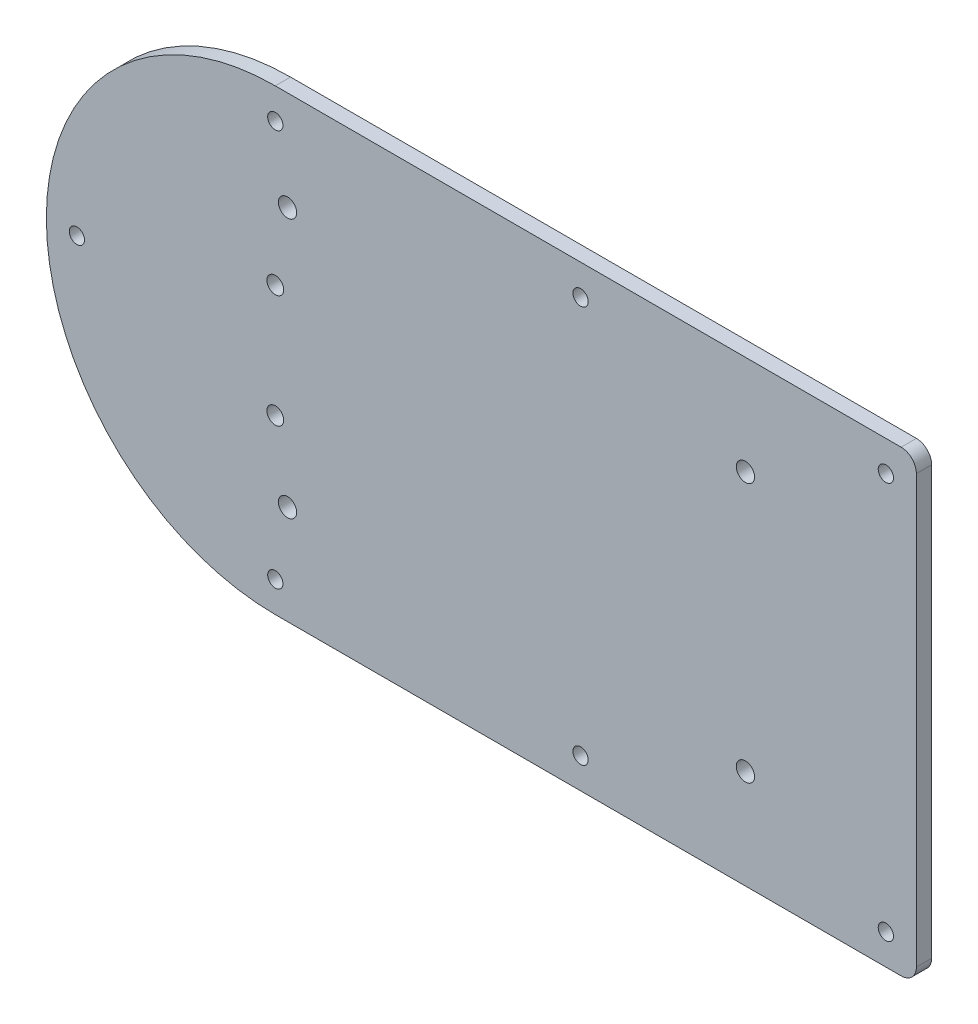
ISO-10303-21;
HEADER;
FILE_DESCRIPTION(('STEP AP214'),'2;1');
FILE_NAME('part.step','',(''),(''),'','','');
FILE_SCHEMA(('AUTOMOTIVE_DESIGN { 1 0 10303 214 1 1 1 1 }'));
ENDSEC;
DATA;
#1=APPLICATION_CONTEXT('core data for automotive mechanical design processes');
#2=APPLICATION_PROTOCOL_DEFINITION('international standard','automotive_design',2000,#1);
#3=PRODUCT_CONTEXT('',#1,'mechanical');
#4=PRODUCT('Part','Part','',(#3));
#5=PRODUCT_RELATED_PRODUCT_CATEGORY('part','',(#4));
#6=PRODUCT_DEFINITION_FORMATION('','',#4);
#7=PRODUCT_DEFINITION_CONTEXT('part definition',#1,'design');
#8=PRODUCT_DEFINITION('design','',#6,#7);
#9=PRODUCT_DEFINITION_SHAPE('','',#8);
#10=(LENGTH_UNIT() NAMED_UNIT(*) SI_UNIT(.MILLI.,.METRE.));
#11=(NAMED_UNIT(*) PLANE_ANGLE_UNIT() SI_UNIT($,.RADIAN.));
#12=(NAMED_UNIT(*) SI_UNIT($,.STERADIAN.) SOLID_ANGLE_UNIT());
#13=UNCERTAINTY_MEASURE_WITH_UNIT(LENGTH_MEASURE(1.E-05),#10,'distance_accuracy_value','');
#14=(GEOMETRIC_REPRESENTATION_CONTEXT(3) GLOBAL_UNCERTAINTY_ASSIGNED_CONTEXT((#13)) GLOBAL_UNIT_ASSIGNED_CONTEXT((#10,
#11,#12)) REPRESENTATION_CONTEXT('',''));
#15=CARTESIAN_POINT('',(0.,0.,0.));
#16=DIRECTION('',(0.,0.,1.));
#17=DIRECTION('',(1.,0.,0.));
#18=AXIS2_PLACEMENT_3D('',#15,#16,#17);
#19=CARTESIAN_POINT('',(30.0006920415225,17.5455264458724,5.));
#20=DIRECTION('',(0.,0.,1.));
#21=DIRECTION('',(1.,0.,0.));
#22=AXIS2_PLACEMENT_3D('',#19,#20,#21);
#23=PLANE('',#22);
#24=CARTESIAN_POINT('',(130.000692041523,82.5455264458725,5.));
#25=DIRECTION('',(0.,0.,1.));
#26=DIRECTION('',(1.,0.,0.));
#27=AXIS2_PLACEMENT_3D('',#24,#25,#26);
#28=CIRCLE('',#27,2.5);
#29=CARTESIAN_POINT('',(132.500692041523,82.5455264458725,5.));
#30=VERTEX_POINT('',#29);
#31=EDGE_CURVE('E225',#30,#30,#28,.T.);
#32=ORIENTED_EDGE('',*,*,#31,.F.);
#33=EDGE_LOOP('',(#32));
#34=FACE_BOUND('',#33,.T.);
#35=CARTESIAN_POINT('',(230.000692041523,-47.4544735541276,5.));
#36=DIRECTION('',(0.,0.,1.));
#37=DIRECTION('',(1.,0.,0.));
#38=AXIS2_PLACEMENT_3D('',#35,#36,#37);
#39=CIRCLE('',#38,2.5);
#40=CARTESIAN_POINT('',(232.500692041523,-47.4544735541276,5.));
#41=VERTEX_POINT('',#40);
#42=EDGE_CURVE('E237',#41,#41,#39,.T.);
#43=ORIENTED_EDGE('',*,*,#42,.F.);
#44=EDGE_LOOP('',(#43));
#45=FACE_BOUND('',#44,.T.);
#46=CARTESIAN_POINT('',(30.0006920415225,-47.4544735541276,5.));
#47=DIRECTION('',(0.,0.,1.));
#48=DIRECTION('',(1.,0.,0.));
#49=AXIS2_PLACEMENT_3D('',#46,#47,#48);
#50=CIRCLE('',#49,2.5);
#51=CARTESIAN_POINT('',(32.5006920415225,-47.4544735541276,5.));
#52=VERTEX_POINT('',#51);
#53=EDGE_CURVE('E249',#52,#52,#50,.T.);
#54=ORIENTED_EDGE('',*,*,#53,.F.);
#55=EDGE_LOOP('',(#54));
#56=FACE_BOUND('',#55,.T.);
#57=CARTESIAN_POINT('',(30.0006920415225,-0.95447355412754,5.));
#58=DIRECTION('',(0.,0.,1.));
#59=DIRECTION('',(1.,0.,0.));
#60=AXIS2_PLACEMENT_3D('',#57,#58,#59);
#61=CIRCLE('',#60,2.75);
#62=CARTESIAN_POINT('',(32.7506920415225,-0.95447355412754,5.));
#63=VERTEX_POINT('',#62);
#64=EDGE_CURVE('E261',#63,#63,#61,.T.);
#65=ORIENTED_EDGE('',*,*,#64,.F.);
#66=EDGE_LOOP('',(#65));
#67=FACE_BOUND('',#66,.T.);
#68=CARTESIAN_POINT('',(34.0006920415225,60.0455264458724,5.));
#69=DIRECTION('',(0.,0.,1.));
#70=DIRECTION('',(1.,0.,0.));
#71=AXIS2_PLACEMENT_3D('',#68,#69,#70);
#72=CIRCLE('',#71,3.);
#73=CARTESIAN_POINT('',(37.0006920415225,60.0455264458724,5.));
#74=VERTEX_POINT('',#73);
#75=EDGE_CURVE('E273',#74,#74,#72,.T.);
#76=ORIENTED_EDGE('',*,*,#75,.F.);
#77=EDGE_LOOP('',(#76));
#78=FACE_BOUND('',#77,.T.);
#79=CARTESIAN_POINT('',(-34.9993079584775,17.5455264458724,5.));
#80=DIRECTION('',(0.,0.,1.));
#81=DIRECTION('',(1.,0.,0.));
#82=AXIS2_PLACEMENT_3D('',#79,#80,#81);
#83=CIRCLE('',#82,2.5);
#84=CARTESIAN_POINT('',(-32.4993079584775,17.5455264458724,5.));
#85=VERTEX_POINT('',#84);
#86=EDGE_CURVE('E285',#85,#85,#83,.T.);
#87=ORIENTED_EDGE('',*,*,#86,.F.);
#88=EDGE_LOOP('',(#87));
#89=FACE_BOUND('',#88,.T.);
#90=CARTESIAN_POINT('',(30.0006920415225,17.5455264458724,5.));
#91=DIRECTION('',(0.,0.,1.));
#92=DIRECTION('',(1.,0.,0.));
#93=AXIS2_PLACEMENT_3D('',#90,#91,#92);
#94=CIRCLE('',#93,75.);
#95=CARTESIAN_POINT('',(30.0006920415225,92.5455264458725,5.));
#96=VERTEX_POINT('',#95);
#97=CARTESIAN_POINT('',(30.0006920415225,-57.4544735541275,5.));
#98=VERTEX_POINT('',#97);
#99=EDGE_CURVE('E129',#96,#98,#94,.T.);
#100=ORIENTED_EDGE('',*,*,#99,.T.);
#101=DIRECTION('',(1.,0.,0.));
#102=VECTOR('',#101,1.);
#103=CARTESIAN_POINT('',(30.0006920415225,-57.4544735541275,5.));
#104=LINE('',#103,#102);
#105=CARTESIAN_POINT('',(235.000692041522,-57.4544735541275,5.));
#106=VERTEX_POINT('',#105);
#107=EDGE_CURVE('E87',#98,#106,#104,.T.);
#108=ORIENTED_EDGE('',*,*,#107,.T.);
#109=CARTESIAN_POINT('',(235.000692041523,-52.4544735541275,5.));
#110=DIRECTION('',(0.,0.,1.));
#111=DIRECTION('',(1.,0.,0.));
#112=AXIS2_PLACEMENT_3D('',#109,#110,#111);
#113=CIRCLE('',#112,5.);
#114=CARTESIAN_POINT('',(240.000692041523,-52.4544735541275,5.));
#115=VERTEX_POINT('',#114);
#116=EDGE_CURVE('E100',#106,#115,#113,.T.);
#117=ORIENTED_EDGE('',*,*,#116,.T.);
#118=DIRECTION('',(0.,1.,0.));
#119=VECTOR('',#118,1.);
#120=CARTESIAN_POINT('',(240.000692041523,87.5455264458724,5.));
#121=LINE('',#120,#119);
#122=CARTESIAN_POINT('',(240.000692041523,87.5455264458724,5.));
#123=VERTEX_POINT('',#122);
#124=EDGE_CURVE('E94',#115,#123,#121,.T.);
#125=ORIENTED_EDGE('',*,*,#124,.T.);
#126=CARTESIAN_POINT('',(235.000692041523,87.5455264458725,5.));
#127=DIRECTION('',(0.,0.,1.));
#128=DIRECTION('',(-1.,0.,0.));
#129=AXIS2_PLACEMENT_3D('',#126,#127,#128);
#130=CIRCLE('',#129,5.);
#131=CARTESIAN_POINT('',(235.000692041522,92.5455264458725,5.));
#132=VERTEX_POINT('',#131);
#133=EDGE_CURVE('E98',#123,#132,#130,.T.);
#134=ORIENTED_EDGE('',*,*,#133,.T.);
#135=DIRECTION('',(-1.,0.,0.));
#136=VECTOR('',#135,1.);
#137=CARTESIAN_POINT('',(30.0006920415225,92.5455264458725,5.));
#138=LINE('',#137,#136);
#139=EDGE_CURVE('E50',#132,#96,#138,.T.);
#140=ORIENTED_EDGE('',*,*,#139,.T.);
#141=EDGE_LOOP('',(#100,#108,#117,#125,#134,#140));
#142=FACE_BOUND('',#141,.T.);
#143=CARTESIAN_POINT('',(184.000692041523,60.0455264458725,5.));
#144=DIRECTION('',(0.,0.,1.));
#145=DIRECTION('',(1.,0.,0.));
#146=AXIS2_PLACEMENT_3D('',#143,#144,#145);
#147=CIRCLE('',#146,2.99999999999999);
#148=CARTESIAN_POINT('',(187.000692041523,60.0455264458725,5.));
#149=VERTEX_POINT('',#148);
#150=EDGE_CURVE('E122',#149,#149,#147,.T.);
#151=ORIENTED_EDGE('',*,*,#150,.F.);
#152=EDGE_LOOP('',(#151));
#153=FACE_BOUND('',#152,.T.);
#154=CARTESIAN_POINT('',(184.000692041523,-24.9544735541275,5.));
#155=DIRECTION('',(0.,0.,1.));
#156=DIRECTION('',(1.,0.,0.));
#157=AXIS2_PLACEMENT_3D('',#154,#155,#156);
#158=CIRCLE('',#157,2.99999999999999);
#159=CARTESIAN_POINT('',(187.000692041523,-24.9544735541275,5.));
#160=VERTEX_POINT('',#159);
#161=EDGE_CURVE('E279',#160,#160,#158,.T.);
#162=ORIENTED_EDGE('',*,*,#161,.F.);
#163=EDGE_LOOP('',(#162));
#164=FACE_BOUND('',#163,.T.);
#165=CARTESIAN_POINT('',(34.0006920415225,-24.9544735541276,5.));
#166=DIRECTION('',(0.,0.,1.));
#167=DIRECTION('',(1.,0.,0.));
#168=AXIS2_PLACEMENT_3D('',#165,#166,#167);
#169=CIRCLE('',#168,3.);
#170=CARTESIAN_POINT('',(37.0006920415225,-24.9544735541276,5.));
#171=VERTEX_POINT('',#170);
#172=EDGE_CURVE('E267',#171,#171,#169,.T.);
#173=ORIENTED_EDGE('',*,*,#172,.F.);
#174=EDGE_LOOP('',(#173));
#175=FACE_BOUND('',#174,.T.);
#176=CARTESIAN_POINT('',(30.0006920415225,36.0455264458724,5.));
#177=DIRECTION('',(0.,0.,1.));
#178=DIRECTION('',(1.,0.,0.));
#179=AXIS2_PLACEMENT_3D('',#176,#177,#178);
#180=CIRCLE('',#179,2.75);
#181=CARTESIAN_POINT('',(32.7506920415225,36.0455264458724,5.));
#182=VERTEX_POINT('',#181);
#183=EDGE_CURVE('E255',#182,#182,#180,.T.);
#184=ORIENTED_EDGE('',*,*,#183,.F.);
#185=EDGE_LOOP('',(#184));
#186=FACE_BOUND('',#185,.T.);
#187=CARTESIAN_POINT('',(30.0006920415225,82.5455264458725,5.));
#188=DIRECTION('',(0.,0.,1.));
#189=DIRECTION('',(1.,0.,0.));
#190=AXIS2_PLACEMENT_3D('',#187,#188,#189);
#191=CIRCLE('',#190,2.5);
#192=CARTESIAN_POINT('',(32.5006920415225,82.5455264458725,5.));
#193=VERTEX_POINT('',#192);
#194=EDGE_CURVE('E243',#193,#193,#191,.T.);
#195=ORIENTED_EDGE('',*,*,#194,.F.);
#196=EDGE_LOOP('',(#195));
#197=FACE_BOUND('',#196,.T.);
#198=CARTESIAN_POINT('',(230.000692041523,82.5455264458725,5.));
#199=DIRECTION('',(0.,0.,1.));
#200=DIRECTION('',(1.,0.,0.));
#201=AXIS2_PLACEMENT_3D('',#198,#199,#200);
#202=CIRCLE('',#201,2.5);
#203=CARTESIAN_POINT('',(232.500692041523,82.5455264458725,5.));
#204=VERTEX_POINT('',#203);
#205=EDGE_CURVE('E231',#204,#204,#202,.T.);
#206=ORIENTED_EDGE('',*,*,#205,.F.);
#207=EDGE_LOOP('',(#206));
#208=FACE_BOUND('',#207,.T.);
#209=CARTESIAN_POINT('',(130.000692041523,-47.4544735541276,5.));
#210=DIRECTION('',(0.,0.,1.));
#211=DIRECTION('',(1.,0.,0.));
#212=AXIS2_PLACEMENT_3D('',#209,#210,#211);
#213=CIRCLE('',#212,2.5);
#214=CARTESIAN_POINT('',(132.500692041523,-47.4544735541276,5.));
#215=VERTEX_POINT('',#214);
#216=EDGE_CURVE('E216',#215,#215,#213,.T.);
#217=ORIENTED_EDGE('',*,*,#216,.F.);
#218=EDGE_LOOP('',(#217));
#219=FACE_BOUND('',#218,.T.);
#220=ADVANCED_FACE('F33',(#34,#45,#56,#67,#78,#89,#142,#153,#164,#175,#186,#197,#208,#219),#23,.T.);
#221=CARTESIAN_POINT('',(30.0006920415225,17.5455264458724,0.));
#222=DIRECTION('',(0.,0.,1.));
#223=DIRECTION('',(1.,0.,0.));
#224=AXIS2_PLACEMENT_3D('',#221,#222,#223);
#225=PLANE('',#224);
#226=CARTESIAN_POINT('',(30.0006920415225,17.5455264458724,0.));
#227=DIRECTION('',(0.,0.,1.));
#228=DIRECTION('',(1.,0.,0.));
#229=AXIS2_PLACEMENT_3D('',#226,#227,#228);
#230=CIRCLE('',#229,75.);
#231=CARTESIAN_POINT('',(30.0006920415225,92.5455264458725,0.));
#232=VERTEX_POINT('',#231);
#233=CARTESIAN_POINT('',(30.0006920415225,-57.4544735541275,0.));
#234=VERTEX_POINT('',#233);
#235=EDGE_CURVE('E118',#232,#234,#230,.T.);
#236=ORIENTED_EDGE('',*,*,#235,.F.);
#237=DIRECTION('',(-1.,0.,0.));
#238=VECTOR('',#237,1.);
#239=CARTESIAN_POINT('',(30.0006920415225,92.5455264458725,0.));
#240=LINE('',#239,#238);
#241=CARTESIAN_POINT('',(235.000692041522,92.5455264458725,0.));
#242=VERTEX_POINT('',#241);
#243=EDGE_CURVE('E79',#242,#232,#240,.T.);
#244=ORIENTED_EDGE('',*,*,#243,.F.);
#245=CARTESIAN_POINT('',(235.000692041523,87.5455264458725,0.));
#246=DIRECTION('',(0.,0.,1.));
#247=DIRECTION('',(-1.,0.,0.));
#248=AXIS2_PLACEMENT_3D('',#245,#246,#247);
#249=CIRCLE('',#248,5.);
#250=CARTESIAN_POINT('',(240.000692041523,87.5455264458724,0.));
#251=VERTEX_POINT('',#250);
#252=EDGE_CURVE('E73',#251,#242,#249,.T.);
#253=ORIENTED_EDGE('',*,*,#252,.F.);
#254=DIRECTION('',(0.,1.,0.));
#255=VECTOR('',#254,1.);
#256=CARTESIAN_POINT('',(240.000692041523,87.5455264458724,0.));
#257=LINE('',#256,#255);
#258=CARTESIAN_POINT('',(240.000692041523,-52.4544735541275,0.));
#259=VERTEX_POINT('',#258);
#260=EDGE_CURVE('E108',#259,#251,#257,.T.);
#261=ORIENTED_EDGE('',*,*,#260,.F.);
#262=CARTESIAN_POINT('',(235.000692041523,-52.4544735541275,0.));
#263=DIRECTION('',(0.,0.,1.));
#264=DIRECTION('',(1.,0.,0.));
#265=AXIS2_PLACEMENT_3D('',#262,#263,#264);
#266=CIRCLE('',#265,5.);
#267=CARTESIAN_POINT('',(235.000692041522,-57.4544735541275,0.));
#268=VERTEX_POINT('',#267);
#269=EDGE_CURVE('E124',#268,#259,#266,.T.);
#270=ORIENTED_EDGE('',*,*,#269,.F.);
#271=DIRECTION('',(1.,0.,0.));
#272=VECTOR('',#271,1.);
#273=CARTESIAN_POINT('',(30.0006920415225,-57.4544735541275,0.));
#274=LINE('',#273,#272);
#275=EDGE_CURVE('E121',#234,#268,#274,.T.);
#276=ORIENTED_EDGE('',*,*,#275,.F.);
#277=EDGE_LOOP('',(#236,#244,#253,#261,#270,#276));
#278=FACE_BOUND('',#277,.T.);
#279=CARTESIAN_POINT('',(184.000692041523,60.0455264458725,0.));
#280=DIRECTION('',(0.,0.,1.));
#281=DIRECTION('',(1.,0.,0.));
#282=AXIS2_PLACEMENT_3D('',#279,#280,#281);
#283=CIRCLE('',#282,2.99999999999999);
#284=CARTESIAN_POINT('',(187.000692041523,60.0455264458725,0.));
#285=VERTEX_POINT('',#284);
#286=EDGE_CURVE('E288',#285,#285,#283,.T.);
#287=ORIENTED_EDGE('',*,*,#286,.T.);
#288=EDGE_LOOP('',(#287));
#289=FACE_BOUND('',#288,.T.);
#290=CARTESIAN_POINT('',(-34.9993079584775,17.5455264458724,0.));
#291=DIRECTION('',(0.,0.,1.));
#292=DIRECTION('',(1.,0.,0.));
#293=AXIS2_PLACEMENT_3D('',#290,#291,#292);
#294=CIRCLE('',#293,2.5);
#295=CARTESIAN_POINT('',(-32.4993079584775,17.5455264458724,0.));
#296=VERTEX_POINT('',#295);
#297=EDGE_CURVE('E282',#296,#296,#294,.T.);
#298=ORIENTED_EDGE('',*,*,#297,.T.);
#299=EDGE_LOOP('',(#298));
#300=FACE_BOUND('',#299,.T.);
#301=CARTESIAN_POINT('',(184.000692041523,-24.9544735541275,0.));
#302=DIRECTION('',(0.,0.,1.));
#303=DIRECTION('',(1.,0.,0.));
#304=AXIS2_PLACEMENT_3D('',#301,#302,#303);
#305=CIRCLE('',#304,2.99999999999999);
#306=CARTESIAN_POINT('',(187.000692041523,-24.9544735541275,0.));
#307=VERTEX_POINT('',#306);
#308=EDGE_CURVE('E276',#307,#307,#305,.T.);
#309=ORIENTED_EDGE('',*,*,#308,.T.);
#310=EDGE_LOOP('',(#309));
#311=FACE_BOUND('',#310,.T.);
#312=CARTESIAN_POINT('',(34.0006920415225,60.0455264458724,0.));
#313=DIRECTION('',(0.,0.,1.));
#314=DIRECTION('',(1.,0.,0.));
#315=AXIS2_PLACEMENT_3D('',#312,#313,#314);
#316=CIRCLE('',#315,3.);
#317=CARTESIAN_POINT('',(37.0006920415225,60.0455264458724,0.));
#318=VERTEX_POINT('',#317);
#319=EDGE_CURVE('E270',#318,#318,#316,.T.);
#320=ORIENTED_EDGE('',*,*,#319,.T.);
#321=EDGE_LOOP('',(#320));
#322=FACE_BOUND('',#321,.T.);
#323=CARTESIAN_POINT('',(34.0006920415225,-24.9544735541276,0.));
#324=DIRECTION('',(0.,0.,1.));
#325=DIRECTION('',(1.,0.,0.));
#326=AXIS2_PLACEMENT_3D('',#323,#324,#325);
#327=CIRCLE('',#326,3.);
#328=CARTESIAN_POINT('',(37.0006920415225,-24.9544735541276,0.));
#329=VERTEX_POINT('',#328);
#330=EDGE_CURVE('E264',#329,#329,#327,.T.);
#331=ORIENTED_EDGE('',*,*,#330,.T.);
#332=EDGE_LOOP('',(#331));
#333=FACE_BOUND('',#332,.T.);
#334=CARTESIAN_POINT('',(30.0006920415225,-0.95447355412754,0.));
#335=DIRECTION('',(0.,0.,1.));
#336=DIRECTION('',(1.,0.,0.));
#337=AXIS2_PLACEMENT_3D('',#334,#335,#336);
#338=CIRCLE('',#337,2.75);
#339=CARTESIAN_POINT('',(32.7506920415225,-0.95447355412754,0.));
#340=VERTEX_POINT('',#339);
#341=EDGE_CURVE('E258',#340,#340,#338,.T.);
#342=ORIENTED_EDGE('',*,*,#341,.T.);
#343=EDGE_LOOP('',(#342));
#344=FACE_BOUND('',#343,.T.);
#345=CARTESIAN_POINT('',(30.0006920415225,36.0455264458724,0.));
#346=DIRECTION('',(0.,0.,1.));
#347=DIRECTION('',(1.,0.,0.));
#348=AXIS2_PLACEMENT_3D('',#345,#346,#347);
#349=CIRCLE('',#348,2.75);
#350=CARTESIAN_POINT('',(32.7506920415225,36.0455264458724,0.));
#351=VERTEX_POINT('',#350);
#352=EDGE_CURVE('E252',#351,#351,#349,.T.);
#353=ORIENTED_EDGE('',*,*,#352,.T.);
#354=EDGE_LOOP('',(#353));
#355=FACE_BOUND('',#354,.T.);
#356=CARTESIAN_POINT('',(30.0006920415225,-47.4544735541276,0.));
#357=DIRECTION('',(0.,0.,1.));
#358=DIRECTION('',(1.,0.,0.));
#359=AXIS2_PLACEMENT_3D('',#356,#357,#358);
#360=CIRCLE('',#359,2.5);
#361=CARTESIAN_POINT('',(32.5006920415225,-47.4544735541276,0.));
#362=VERTEX_POINT('',#361);
#363=EDGE_CURVE('E246',#362,#362,#360,.T.);
#364=ORIENTED_EDGE('',*,*,#363,.T.);
#365=EDGE_LOOP('',(#364));
#366=FACE_BOUND('',#365,.T.);
#367=CARTESIAN_POINT('',(30.0006920415225,82.5455264458725,0.));
#368=DIRECTION('',(0.,0.,1.));
#369=DIRECTION('',(1.,0.,0.));
#370=AXIS2_PLACEMENT_3D('',#367,#368,#369);
#371=CIRCLE('',#370,2.5);
#372=CARTESIAN_POINT('',(32.5006920415225,82.5455264458725,0.));
#373=VERTEX_POINT('',#372);
#374=EDGE_CURVE('E240',#373,#373,#371,.T.);
#375=ORIENTED_EDGE('',*,*,#374,.T.);
#376=EDGE_LOOP('',(#375));
#377=FACE_BOUND('',#376,.T.);
#378=CARTESIAN_POINT('',(230.000692041523,-47.4544735541276,0.));
#379=DIRECTION('',(0.,0.,1.));
#380=DIRECTION('',(1.,0.,0.));
#381=AXIS2_PLACEMENT_3D('',#378,#379,#380);
#382=CIRCLE('',#381,2.5);
#383=CARTESIAN_POINT('',(232.500692041523,-47.4544735541276,0.));
#384=VERTEX_POINT('',#383);
#385=EDGE_CURVE('E234',#384,#384,#382,.T.);
#386=ORIENTED_EDGE('',*,*,#385,.T.);
#387=EDGE_LOOP('',(#386));
#388=FACE_BOUND('',#387,.T.);
#389=CARTESIAN_POINT('',(230.000692041523,82.5455264458725,0.));
#390=DIRECTION('',(0.,0.,1.));
#391=DIRECTION('',(1.,0.,0.));
#392=AXIS2_PLACEMENT_3D('',#389,#390,#391);
#393=CIRCLE('',#392,2.5);
#394=CARTESIAN_POINT('',(232.500692041523,82.5455264458725,0.));
#395=VERTEX_POINT('',#394);
#396=EDGE_CURVE('E228',#395,#395,#393,.T.);
#397=ORIENTED_EDGE('',*,*,#396,.T.);
#398=EDGE_LOOP('',(#397));
#399=FACE_BOUND('',#398,.T.);
#400=CARTESIAN_POINT('',(130.000692041523,82.5455264458725,0.));
#401=DIRECTION('',(0.,0.,1.));
#402=DIRECTION('',(1.,0.,0.));
#403=AXIS2_PLACEMENT_3D('',#400,#401,#402);
#404=CIRCLE('',#403,2.5);
#405=CARTESIAN_POINT('',(132.500692041523,82.5455264458725,0.));
#406=VERTEX_POINT('',#405);
#407=EDGE_CURVE('E222',#406,#406,#404,.T.);
#408=ORIENTED_EDGE('',*,*,#407,.T.);
#409=EDGE_LOOP('',(#408));
#410=FACE_BOUND('',#409,.T.);
#411=CARTESIAN_POINT('',(130.000692041523,-47.4544735541276,0.));
#412=DIRECTION('',(0.,0.,1.));
#413=DIRECTION('',(1.,0.,0.));
#414=AXIS2_PLACEMENT_3D('',#411,#412,#413);
#415=CIRCLE('',#414,2.5);
#416=CARTESIAN_POINT('',(132.500692041523,-47.4544735541276,0.));
#417=VERTEX_POINT('',#416);
#418=EDGE_CURVE('E219',#417,#417,#415,.T.);
#419=ORIENTED_EDGE('',*,*,#418,.T.);
#420=EDGE_LOOP('',(#419));
#421=FACE_BOUND('',#420,.T.);
#422=ADVANCED_FACE('F138',(#278,#289,#300,#311,#322,#333,#344,#355,#366,#377,#388,#399,#410,
#421),#225,.F.);
#423=CARTESIAN_POINT('',(30.0006920415225,17.5455264458724,5.));
#424=DIRECTION('',(0.,0.,-1.));
#425=DIRECTION('',(-1.,0.,0.));
#426=AXIS2_PLACEMENT_3D('',#423,#424,#425);
#427=CYLINDRICAL_SURFACE('',#426,75.);
#428=ORIENTED_EDGE('',*,*,#235,.T.);
#429=DIRECTION('',(0.,0.,-1.));
#430=VECTOR('',#429,1.);
#431=CARTESIAN_POINT('',(30.0006920415225,-57.4544735541275,5.));
#432=LINE('',#431,#430);
#433=EDGE_CURVE('E11',#98,#234,#432,.T.);
#434=ORIENTED_EDGE('',*,*,#433,.F.);
#435=ORIENTED_EDGE('',*,*,#99,.F.);
#436=DIRECTION('',(0.,0.,-1.));
#437=VECTOR('',#436,1.);
#438=CARTESIAN_POINT('',(30.0006920415225,92.5455264458725,5.));
#439=LINE('',#438,#437);
#440=EDGE_CURVE('E114',#96,#232,#439,.T.);
#441=ORIENTED_EDGE('',*,*,#440,.T.);
#442=EDGE_LOOP('',(#428,#434,#435,#441));
#443=FACE_BOUND('',#442,.T.);
#444=ADVANCED_FACE('F35',(#443),#427,.T.);
#445=CARTESIAN_POINT('',(30.0006920415225,-57.4544735541275,5.));
#446=DIRECTION('',(0.,1.,0.));
#447=DIRECTION('',(0.,0.,1.));
#448=AXIS2_PLACEMENT_3D('',#445,#446,#447);
#449=PLANE('',#448);
#450=ORIENTED_EDGE('',*,*,#275,.T.);
#451=DIRECTION('',(0.,0.,-1.));
#452=VECTOR('',#451,1.);
#453=CARTESIAN_POINT('',(235.000692041522,-57.4544735541275,5.));
#454=LINE('',#453,#452);
#455=EDGE_CURVE('E42',#106,#268,#454,.T.);
#456=ORIENTED_EDGE('',*,*,#455,.F.);
#457=ORIENTED_EDGE('',*,*,#107,.F.);
#458=ORIENTED_EDGE('',*,*,#433,.T.);
#459=EDGE_LOOP('',(#450,#456,#457,#458));
#460=FACE_BOUND('',#459,.T.);
#461=ADVANCED_FACE('F427',(#460),#449,.F.);
#462=CARTESIAN_POINT('',(235.000692041523,-52.4544735541275,5.));
#463=DIRECTION('',(0.,0.,-1.));
#464=DIRECTION('',(-1.,0.,0.));
#465=AXIS2_PLACEMENT_3D('',#462,#463,#464);
#466=CYLINDRICAL_SURFACE('',#465,5.);
#467=ORIENTED_EDGE('',*,*,#269,.T.);
#468=DIRECTION('',(0.,0.,-1.));
#469=VECTOR('',#468,1.);
#470=CARTESIAN_POINT('',(240.000692041523,-52.4544735541275,5.));
#471=LINE('',#470,#469);
#472=EDGE_CURVE('E109',#115,#259,#471,.T.);
#473=ORIENTED_EDGE('',*,*,#472,.F.);
#474=ORIENTED_EDGE('',*,*,#116,.F.);
#475=ORIENTED_EDGE('',*,*,#455,.T.);
#476=EDGE_LOOP('',(#467,#473,#474,#475));
#477=FACE_BOUND('',#476,.T.);
#478=ADVANCED_FACE('F135',(#477),#466,.T.);
#479=CARTESIAN_POINT('',(240.000692041523,87.5455264458724,5.));
#480=DIRECTION('',(-1.,0.,0.));
#481=DIRECTION('',(0.,0.,1.));
#482=AXIS2_PLACEMENT_3D('',#479,#480,#481);
#483=PLANE('',#482);
#484=ORIENTED_EDGE('',*,*,#260,.T.);
#485=DIRECTION('',(0.,0.,-1.));
#486=VECTOR('',#485,1.);
#487=CARTESIAN_POINT('',(240.000692041523,87.5455264458724,5.));
#488=LINE('',#487,#486);
#489=EDGE_CURVE('E105',#123,#251,#488,.T.);
#490=ORIENTED_EDGE('',*,*,#489,.F.);
#491=ORIENTED_EDGE('',*,*,#124,.F.);
#492=ORIENTED_EDGE('',*,*,#472,.T.);
#493=EDGE_LOOP('',(#484,#490,#491,#492));
#494=FACE_BOUND('',#493,.T.);
#495=ADVANCED_FACE('F106',(#494),#483,.F.);
#496=CARTESIAN_POINT('',(235.000692041523,87.5455264458725,5.));
#497=DIRECTION('',(0.,0.,-1.));
#498=DIRECTION('',(-1.,0.,0.));
#499=AXIS2_PLACEMENT_3D('',#496,#497,#498);
#500=CYLINDRICAL_SURFACE('',#499,5.);
#501=ORIENTED_EDGE('',*,*,#252,.T.);
#502=DIRECTION('',(0.,0.,-1.));
#503=VECTOR('',#502,1.);
#504=CARTESIAN_POINT('',(235.000692041522,92.5455264458725,5.));
#505=LINE('',#504,#503);
#506=EDGE_CURVE('E110',#132,#242,#505,.T.);
#507=ORIENTED_EDGE('',*,*,#506,.F.);
#508=ORIENTED_EDGE('',*,*,#133,.F.);
#509=ORIENTED_EDGE('',*,*,#489,.T.);
#510=EDGE_LOOP('',(#501,#507,#508,#509));
#511=FACE_BOUND('',#510,.T.);
#512=ADVANCED_FACE('F112',(#511),#500,.T.);
#513=CARTESIAN_POINT('',(30.0006920415225,92.5455264458725,5.));
#514=DIRECTION('',(0.,-1.,0.));
#515=DIRECTION('',(0.,0.,-1.));
#516=AXIS2_PLACEMENT_3D('',#513,#514,#515);
#517=PLANE('',#516);
#518=ORIENTED_EDGE('',*,*,#243,.T.);
#519=ORIENTED_EDGE('',*,*,#440,.F.);
#520=ORIENTED_EDGE('',*,*,#139,.F.);
#521=ORIENTED_EDGE('',*,*,#506,.T.);
#522=EDGE_LOOP('',(#518,#519,#520,#521));
#523=FACE_BOUND('',#522,.T.);
#524=ADVANCED_FACE('F143',(#523),#517,.F.);
#525=CARTESIAN_POINT('',(184.000692041523,60.0455264458725,5.));
#526=DIRECTION('',(0.,0.,-1.));
#527=DIRECTION('',(-1.,0.,0.));
#528=AXIS2_PLACEMENT_3D('',#525,#526,#527);
#529=CYLINDRICAL_SURFACE('',#528,2.99999999999999);
#530=ORIENTED_EDGE('',*,*,#150,.T.);
#531=EDGE_LOOP('',(#530));
#532=FACE_BOUND('',#531,.T.);
#533=ORIENTED_EDGE('',*,*,#286,.F.);
#534=EDGE_LOOP('',(#533));
#535=FACE_BOUND('',#534,.T.);
#536=ADVANCED_FACE('F145',(#532,#535),#529,.F.);
#537=CARTESIAN_POINT('',(-34.9993079584775,17.5455264458724,5.));
#538=DIRECTION('',(0.,0.,-1.));
#539=DIRECTION('',(-1.,0.,0.));
#540=AXIS2_PLACEMENT_3D('',#537,#538,#539);
#541=CYLINDRICAL_SURFACE('',#540,2.5);
#542=ORIENTED_EDGE('',*,*,#86,.T.);
#543=EDGE_LOOP('',(#542));
#544=FACE_BOUND('',#543,.T.);
#545=ORIENTED_EDGE('',*,*,#297,.F.);
#546=EDGE_LOOP('',(#545));
#547=FACE_BOUND('',#546,.T.);
#548=ADVANCED_FACE('F151',(#544,#547),#541,.F.);
#549=CARTESIAN_POINT('',(184.000692041523,-24.9544735541275,5.));
#550=DIRECTION('',(0.,0.,-1.));
#551=DIRECTION('',(-1.,0.,0.));
#552=AXIS2_PLACEMENT_3D('',#549,#550,#551);
#553=CYLINDRICAL_SURFACE('',#552,2.99999999999999);
#554=ORIENTED_EDGE('',*,*,#161,.T.);
#555=EDGE_LOOP('',(#554));
#556=FACE_BOUND('',#555,.T.);
#557=ORIENTED_EDGE('',*,*,#308,.F.);
#558=EDGE_LOOP('',(#557));
#559=FACE_BOUND('',#558,.T.);
#560=ADVANCED_FACE('F167',(#556,#559),#553,.F.);
#561=CARTESIAN_POINT('',(34.0006920415225,60.0455264458724,5.));
#562=DIRECTION('',(0.,0.,-1.));
#563=DIRECTION('',(-1.,0.,0.));
#564=AXIS2_PLACEMENT_3D('',#561,#562,#563);
#565=CYLINDRICAL_SURFACE('',#564,3.);
#566=ORIENTED_EDGE('',*,*,#75,.T.);
#567=EDGE_LOOP('',(#566));
#568=FACE_BOUND('',#567,.T.);
#569=ORIENTED_EDGE('',*,*,#319,.F.);
#570=EDGE_LOOP('',(#569));
#571=FACE_BOUND('',#570,.T.);
#572=ADVANCED_FACE('F171',(#568,#571),#565,.F.);
#573=CARTESIAN_POINT('',(34.0006920415225,-24.9544735541276,5.));
#574=DIRECTION('',(0.,0.,-1.));
#575=DIRECTION('',(-1.,0.,0.));
#576=AXIS2_PLACEMENT_3D('',#573,#574,#575);
#577=CYLINDRICAL_SURFACE('',#576,3.);
#578=ORIENTED_EDGE('',*,*,#172,.T.);
#579=EDGE_LOOP('',(#578));
#580=FACE_BOUND('',#579,.T.);
#581=ORIENTED_EDGE('',*,*,#330,.F.);
#582=EDGE_LOOP('',(#581));
#583=FACE_BOUND('',#582,.T.);
#584=ADVANCED_FACE('F175',(#580,#583),#577,.F.);
#585=CARTESIAN_POINT('',(30.0006920415225,-0.95447355412754,5.));
#586=DIRECTION('',(0.,0.,-1.));
#587=DIRECTION('',(-1.,0.,0.));
#588=AXIS2_PLACEMENT_3D('',#585,#586,#587);
#589=CYLINDRICAL_SURFACE('',#588,2.75);
#590=ORIENTED_EDGE('',*,*,#64,.T.);
#591=EDGE_LOOP('',(#590));
#592=FACE_BOUND('',#591,.T.);
#593=ORIENTED_EDGE('',*,*,#341,.F.);
#594=EDGE_LOOP('',(#593));
#595=FACE_BOUND('',#594,.T.);
#596=ADVANCED_FACE('F179',(#592,#595),#589,.F.);
#597=CARTESIAN_POINT('',(30.0006920415225,36.0455264458724,5.));
#598=DIRECTION('',(0.,0.,-1.));
#599=DIRECTION('',(-1.,0.,0.));
#600=AXIS2_PLACEMENT_3D('',#597,#598,#599);
#601=CYLINDRICAL_SURFACE('',#600,2.75);
#602=ORIENTED_EDGE('',*,*,#183,.T.);
#603=EDGE_LOOP('',(#602));
#604=FACE_BOUND('',#603,.T.);
#605=ORIENTED_EDGE('',*,*,#352,.F.);
#606=EDGE_LOOP('',(#605));
#607=FACE_BOUND('',#606,.T.);
#608=ADVANCED_FACE('F183',(#604,#607),#601,.F.);
#609=CARTESIAN_POINT('',(30.0006920415225,-47.4544735541276,5.));
#610=DIRECTION('',(0.,0.,-1.));
#611=DIRECTION('',(-1.,0.,0.));
#612=AXIS2_PLACEMENT_3D('',#609,#610,#611);
#613=CYLINDRICAL_SURFACE('',#612,2.5);
#614=ORIENTED_EDGE('',*,*,#53,.T.);
#615=EDGE_LOOP('',(#614));
#616=FACE_BOUND('',#615,.T.);
#617=ORIENTED_EDGE('',*,*,#363,.F.);
#618=EDGE_LOOP('',(#617));
#619=FACE_BOUND('',#618,.T.);
#620=ADVANCED_FACE('F187',(#616,#619),#613,.F.);
#621=CARTESIAN_POINT('',(30.0006920415225,82.5455264458725,5.));
#622=DIRECTION('',(0.,0.,-1.));
#623=DIRECTION('',(-1.,0.,0.));
#624=AXIS2_PLACEMENT_3D('',#621,#622,#623);
#625=CYLINDRICAL_SURFACE('',#624,2.5);
#626=ORIENTED_EDGE('',*,*,#194,.T.);
#627=EDGE_LOOP('',(#626));
#628=FACE_BOUND('',#627,.T.);
#629=ORIENTED_EDGE('',*,*,#374,.F.);
#630=EDGE_LOOP('',(#629));
#631=FACE_BOUND('',#630,.T.);
#632=ADVANCED_FACE('F191',(#628,#631),#625,.F.);
#633=CARTESIAN_POINT('',(230.000692041523,-47.4544735541276,5.));
#634=DIRECTION('',(0.,0.,-1.));
#635=DIRECTION('',(-1.,0.,0.));
#636=AXIS2_PLACEMENT_3D('',#633,#634,#635);
#637=CYLINDRICAL_SURFACE('',#636,2.5);
#638=ORIENTED_EDGE('',*,*,#42,.T.);
#639=EDGE_LOOP('',(#638));
#640=FACE_BOUND('',#639,.T.);
#641=ORIENTED_EDGE('',*,*,#385,.F.);
#642=EDGE_LOOP('',(#641));
#643=FACE_BOUND('',#642,.T.);
#644=ADVANCED_FACE('F195',(#640,#643),#637,.F.);
#645=CARTESIAN_POINT('',(230.000692041523,82.5455264458725,5.));
#646=DIRECTION('',(0.,0.,-1.));
#647=DIRECTION('',(-1.,0.,0.));
#648=AXIS2_PLACEMENT_3D('',#645,#646,#647);
#649=CYLINDRICAL_SURFACE('',#648,2.5);
#650=ORIENTED_EDGE('',*,*,#205,.T.);
#651=EDGE_LOOP('',(#650));
#652=FACE_BOUND('',#651,.T.);
#653=ORIENTED_EDGE('',*,*,#396,.F.);
#654=EDGE_LOOP('',(#653));
#655=FACE_BOUND('',#654,.T.);
#656=ADVANCED_FACE('F199',(#652,#655),#649,.F.);
#657=CARTESIAN_POINT('',(130.000692041523,82.5455264458725,5.));
#658=DIRECTION('',(0.,0.,-1.));
#659=DIRECTION('',(-1.,0.,0.));
#660=AXIS2_PLACEMENT_3D('',#657,#658,#659);
#661=CYLINDRICAL_SURFACE('',#660,2.5);
#662=ORIENTED_EDGE('',*,*,#31,.T.);
#663=EDGE_LOOP('',(#662));
#664=FACE_BOUND('',#663,.T.);
#665=ORIENTED_EDGE('',*,*,#407,.F.);
#666=EDGE_LOOP('',(#665));
#667=FACE_BOUND('',#666,.T.);
#668=ADVANCED_FACE('F203',(#664,#667),#661,.F.);
#669=CARTESIAN_POINT('',(130.000692041523,-47.4544735541276,5.));
#670=DIRECTION('',(0.,0.,-1.));
#671=DIRECTION('',(-1.,0.,0.));
#672=AXIS2_PLACEMENT_3D('',#669,#670,#671);
#673=CYLINDRICAL_SURFACE('',#672,2.5);
#674=ORIENTED_EDGE('',*,*,#216,.T.);
#675=EDGE_LOOP('',(#674));
#676=FACE_BOUND('',#675,.T.);
#677=ORIENTED_EDGE('',*,*,#418,.F.);
#678=EDGE_LOOP('',(#677));
#679=FACE_BOUND('',#678,.T.);
#680=ADVANCED_FACE('F207',(#676,#679),#673,.F.);
#681=CLOSED_SHELL('',(#220,#422,#444,#461,#478,#495,#512,#524,#536,#548,#560,#572,#584,#596,
#608,#620,#632,#644,#656,#668,#680));
#682=MANIFOLD_SOLID_BREP('B2',#681);
#683=ADVANCED_BREP_SHAPE_REPRESENTATION('',(#18,#682),#14);
#684=SHAPE_DEFINITION_REPRESENTATION(#9,#683);
ENDSEC;
END-ISO-10303-21;
